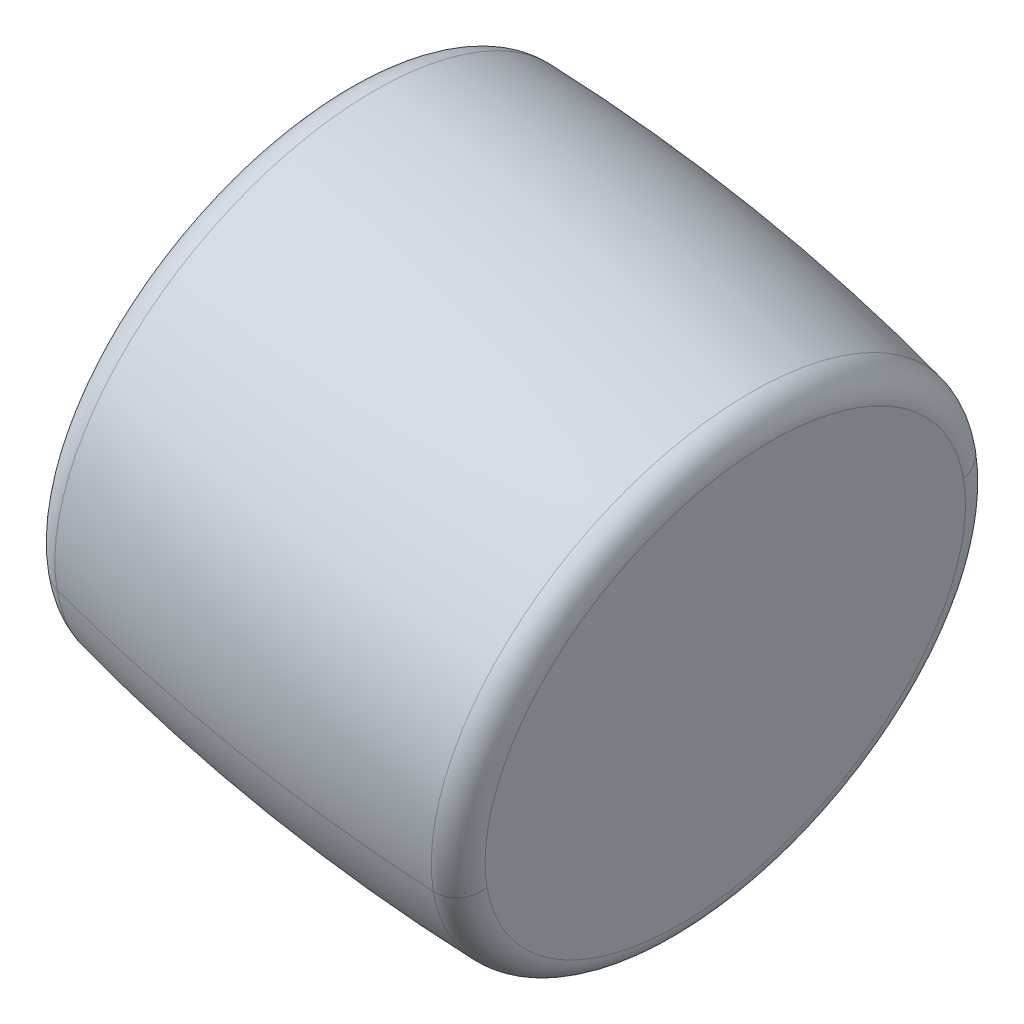
ISO-10303-21;
HEADER;
FILE_DESCRIPTION(('STEP AP214'),'2;1');
FILE_NAME('part.step','',(''),(''),'','','');
FILE_SCHEMA(('AUTOMOTIVE_DESIGN { 1 0 10303 214 1 1 1 1 }'));
ENDSEC;
DATA;
#1=APPLICATION_CONTEXT('core data for automotive mechanical design processes');
#2=APPLICATION_PROTOCOL_DEFINITION('international standard','automotive_design',2000,#1);
#3=PRODUCT_CONTEXT('',#1,'mechanical');
#4=PRODUCT('Part','Part','',(#3));
#5=PRODUCT_RELATED_PRODUCT_CATEGORY('part','',(#4));
#6=PRODUCT_DEFINITION_FORMATION('','',#4);
#7=PRODUCT_DEFINITION_CONTEXT('part definition',#1,'design');
#8=PRODUCT_DEFINITION('design','',#6,#7);
#9=PRODUCT_DEFINITION_SHAPE('','',#8);
#10=(LENGTH_UNIT() NAMED_UNIT(*) SI_UNIT(.MILLI.,.METRE.));
#11=(NAMED_UNIT(*) PLANE_ANGLE_UNIT() SI_UNIT($,.RADIAN.));
#12=(NAMED_UNIT(*) SI_UNIT($,.STERADIAN.) SOLID_ANGLE_UNIT());
#13=UNCERTAINTY_MEASURE_WITH_UNIT(LENGTH_MEASURE(1.E-05),#10,'distance_accuracy_value','');
#14=(GEOMETRIC_REPRESENTATION_CONTEXT(3) GLOBAL_UNCERTAINTY_ASSIGNED_CONTEXT((#13)) GLOBAL_UNIT_ASSIGNED_CONTEXT((#10,
#11,#12)) REPRESENTATION_CONTEXT('',''));
#15=CARTESIAN_POINT('',(0.,0.,0.));
#16=DIRECTION('',(0.,0.,1.));
#17=DIRECTION('',(1.,0.,0.));
#18=AXIS2_PLACEMENT_3D('',#15,#16,#17);
#19=CARTESIAN_POINT('',(13.1271658295199,31.470897780581,0.));
#20=DIRECTION('',(0.981627183447684,-0.190808995376441,0.));
#21=DIRECTION('',(0.190808995376441,0.981627183447684,0.));
#22=AXIS2_PLACEMENT_3D('',#19,#20,#21);
#23=PLANE('',#22);
#24=CARTESIAN_POINT('',(12.8582091754808,30.0872357459221,4.33817842139178));
#25=CARTESIAN_POINT('',(12.8446648204057,30.0175560796265,4.31511603856887));
#26=CARTESIAN_POINT('',(12.8312286848676,29.9484331545849,4.29030854774755));
#27=CARTESIAN_POINT('',(12.8046047498575,29.8114648828077,4.23726961898303));
#28=CARTESIAN_POINT('',(12.7914169503855,29.7436195360721,4.20903818103983));
#29=CARTESIAN_POINT('',(12.7653215844995,29.609370516705,4.14921762690648));
#30=CARTESIAN_POINT('',(12.7524140180855,29.5429668440735,4.11762851071633));
#31=CARTESIAN_POINT('',(12.7269101798973,29.4117609709,4.05116916810763));
#32=CARTESIAN_POINT('',(12.7143139081232,29.346958770358,4.01629894168908));
#33=CARTESIAN_POINT('',(12.6894630138139,29.2191120022383,3.94336125890207));
#34=CARTESIAN_POINT('',(12.6772083912787,29.1560674346607,3.9052938025336));
#35=CARTESIAN_POINT('',(12.6530703154741,29.0318877998424,3.82605340121762));
#36=CARTESIAN_POINT('',(12.6411868622047,28.9707527326018,3.78488045627011));
#37=CARTESIAN_POINT('',(12.6178197538633,28.8505393815422,3.69952825804131));
#38=CARTESIAN_POINT('',(12.6063360987912,28.7914610977232,3.65534900476001));
#39=CARTESIAN_POINT('',(12.5837962518007,28.6755036373687,3.56409062396206));
#40=CARTESIAN_POINT('',(12.5727400598823,28.6186244608333,3.51701149644541));
#41=CARTESIAN_POINT('',(12.5510817745805,28.5072022422051,3.42006678427347));
#42=CARTESIAN_POINT('',(12.5404796811972,28.4526592001123,3.37020119961819));
#43=CARTESIAN_POINT('',(12.5197551343248,28.3460406492705,3.26780370390297));
#44=CARTESIAN_POINT('',(12.5096326808357,28.2939651405216,3.21527179284305));
#45=CARTESIAN_POINT('',(12.4898917996321,28.1924071108469,3.10766819824725));
#46=CARTESIAN_POINT('',(12.4802733719176,28.142924589921,3.05259651471136));
#47=CARTESIAN_POINT('',(12.4615637138972,28.0466717436148,2.9400460476854));
#48=CARTESIAN_POINT('',(12.4524724835913,27.9999014182344,2.88256726419531));
#49=CARTESIAN_POINT('',(12.4348391219584,27.9091856368308,2.7653410686816));
#50=CARTESIAN_POINT('',(12.4262969906315,27.8652401808076,2.70559365665796));
#51=CARTESIAN_POINT('',(12.4097824056989,27.7802800065708,2.58397414082686));
#52=CARTESIAN_POINT('',(12.4018099520933,27.7392652883571,2.52210203701938));
#53=CARTESIAN_POINT('',(12.3864539289427,27.6602653977881,2.39638219293779));
#54=CARTESIAN_POINT('',(12.3790703593976,27.6222802254327,2.33253445266366));
#55=CARTESIAN_POINT('',(12.3649098920337,27.5494309361876,2.20301715044755));
#56=CARTESIAN_POINT('',(12.3581329942149,27.5145668192978,2.13734758850556));
#57=CARTESIAN_POINT('',(12.3452021964438,27.4480436316952,2.0043448466804));
#58=CARTESIAN_POINT('',(12.3390482964917,27.4163845609823,1.93701166679722));
#59=CARTESIAN_POINT('',(12.327378319738,27.3563477352078,1.80084390061771));
#60=CARTESIAN_POINT('',(12.3218622429365,27.3279699801462,1.73200931432138));
#61=CARTESIAN_POINT('',(12.3114812011963,27.2745641501718,1.59300456386314));
#62=CARTESIAN_POINT('',(12.3066162362576,27.249536075259,1.52283439970124));
#63=CARTESIAN_POINT('',(12.2975491383698,27.2028899004068,1.38132753958351));
#64=CARTESIAN_POINT('',(12.2933470054206,27.1812718004675,1.30999084362768));
#65=CARTESIAN_POINT('',(12.2856156948181,27.1414976554585,1.16632277627101));
#66=CARTESIAN_POINT('',(12.2820865171647,27.1233416103889,1.09399140487018));
#67=CARTESIAN_POINT('',(12.2757096192519,27.0905353146223,0.948508239232672));
#68=CARTESIAN_POINT('',(12.2728618989925,27.0758850639253,0.875356444996008));
#69=CARTESIAN_POINT('',(12.2678547762751,27.050125650641,0.72840866276651));
#70=CARTESIAN_POINT('',(12.2656953738171,27.0390164880538,0.654612674773676));
#71=CARTESIAN_POINT('',(12.2620700888923,27.0203660139347,0.506554286030679));
#72=CARTESIAN_POINT('',(12.2606042064255,27.0128247024029,0.432291885280516));
#73=CARTESIAN_POINT('',(12.2583694929221,27.0013280980748,0.283479575650885));
#74=CARTESIAN_POINT('',(12.2576006618856,26.9973728052784,0.208929666771416));
#75=CARTESIAN_POINT('',(12.2567619034244,26.9930577670681,0.0597219381434687));
#76=CARTESIAN_POINT('',(12.2566919759996,26.992698021654,-0.0149358816050108));
#77=CARTESIAN_POINT('',(12.257251193223,26.9955749448663,-0.164179574743957));
#78=CARTESIAN_POINT('',(12.2578803378711,26.9988116134928,-0.238765448134424));
#79=CARTESIAN_POINT('',(12.2598361835759,27.0088735673679,-0.387685564655395));
#80=CARTESIAN_POINT('',(12.2611628846325,27.0156988526166,-0.462019807785898));
#81=CARTESIAN_POINT('',(12.264510647015,27.0329215970262,-0.610257586084332));
#82=CARTESIAN_POINT('',(12.266531708341,27.0433190561871,-0.684161121252261));
#83=CARTESIAN_POINT('',(12.2712633223485,27.0676611000315,-0.831359443536141));
#84=CARTESIAN_POINT('',(12.27397387503,27.0816056847149,-0.90465423065209));
#85=CARTESIAN_POINT('',(12.2800779417899,27.1130083858782,-1.05045848326998));
#86=CARTESIAN_POINT('',(12.2834714558683,27.1304665023581,-1.12296794877192));
#87=CARTESIAN_POINT('',(12.2909332701491,27.1688542089828,-1.26702687650833));
#88=CARTESIAN_POINT('',(12.2950015703515,27.1897837991275,-1.33857633874279));
#89=CARTESIAN_POINT('',(12.303803155989,27.2350640318659,-1.48054289102272));
#90=CARTESIAN_POINT('',(12.3085364414241,27.2594146744595,-1.55095998106819));
#91=CARTESIAN_POINT('',(12.3186565946276,27.3114783492648,-1.6904921480324));
#92=CARTESIAN_POINT('',(12.324043462396,27.3391913814765,-1.75960722495114));
#93=CARTESIAN_POINT('',(12.33545780283,27.397913072396,-1.89636886138784));
#94=CARTESIAN_POINT('',(12.3414852754956,27.4289217311037,-1.9640154209058));
#95=CARTESIAN_POINT('',(12.3541663050142,27.4941599724404,-2.09767705605391));
#96=CARTESIAN_POINT('',(12.3608198618673,27.5283895550694,-2.16369213168406));
#97=CARTESIAN_POINT('',(12.3747370307597,27.5999871821858,-2.29393176295713));
#98=CARTESIAN_POINT('',(12.382000642799,27.6373552266732,-2.35815631860005));
#99=CARTESIAN_POINT('',(12.3971204233863,27.7151397546144,-2.4846601873187));
#100=CARTESIAN_POINT('',(12.4049765919343,27.7555562380681,-2.54693950039443));
#101=CARTESIAN_POINT('',(12.4212625593408,27.8393402770931,-2.66940284765848));
#102=CARTESIAN_POINT('',(12.4296923581993,27.8827078326644,-2.72958688184681));
#103=CARTESIAN_POINT('',(12.447105278103,27.9722895396846,-2.84771468272618));
#104=CARTESIAN_POINT('',(12.4560883991481,28.0185036911336,-2.90565844941724));
#105=CARTESIAN_POINT('',(12.4745863222997,28.1136672559703,-3.01916612369285));
#106=CARTESIAN_POINT('',(12.4841011244062,28.1626166693582,-3.07473003127741));
#107=CARTESIAN_POINT('',(12.5036394876886,28.2631328346485,-3.18334412901982));
#108=CARTESIAN_POINT('',(12.5136630488647,28.314699586551,-3.23639431917768));
#109=CARTESIAN_POINT('',(12.5341947826494,28.4203262000484,-3.33985317951197));
#110=CARTESIAN_POINT('',(12.5447029552582,28.4743860616435,-3.3902618496884));
#111=CARTESIAN_POINT('',(12.5661785968003,28.5848686595844,-3.48831623115809));
#112=CARTESIAN_POINT('',(12.5771460657336,28.6412913959303,-3.53596194245135));
#113=CARTESIAN_POINT('',(12.5995138783315,28.7563638160591,-3.62837562346292));
#114=CARTESIAN_POINT('',(12.610914221996,28.815013499842,-3.67314359318124));
#115=CARTESIAN_POINT('',(12.6341203196299,28.9343985226195,-3.75969394108267));
#116=CARTESIAN_POINT('',(12.6459260735992,28.995133861614,-3.80147631926578));
#117=CARTESIAN_POINT('',(12.6699145507473,29.1185438780633,-3.88195482668805));
#118=CARTESIAN_POINT('',(12.6820972739261,29.1812185555181,-3.92065095592721));
#119=CARTESIAN_POINT('',(12.7068103402458,29.3083562601003,-3.99486374309686));
#120=CARTESIAN_POINT('',(12.7193406833868,29.3728192872276,-4.03038040102735));
#121=CARTESIAN_POINT('',(12.7447188029367,29.5033783940763,-4.09814868283981));
#122=CARTESIAN_POINT('',(12.7575665793458,29.5694744737976,-4.13040030672177));
#123=CARTESIAN_POINT('',(12.7835486140131,29.7031404545887,-4.19156082345037));
#124=CARTESIAN_POINT('',(12.7966828722715,29.7707103556586,-4.220469716297));
#125=CARTESIAN_POINT('',(12.823206229059,29.9071611973367,-4.27487512689985));
#126=CARTESIAN_POINT('',(12.8365953275881,29.976042137945,-4.30037164465608));
#127=CARTESIAN_POINT('',(12.863596109406,30.114949118481,-4.34789088173388));
#128=CARTESIAN_POINT('',(12.8772077926949,30.1849751584086,-4.36991360105545));
#129=CARTESIAN_POINT('',(12.9046209522948,30.3260036387192,-4.41043218660321));
#130=CARTESIAN_POINT('',(12.918422428606,30.3970060791021,-4.4289280528294));
#131=CARTESIAN_POINT('',(12.9461819252856,30.5398163092263,-4.46234837402804));
#132=CARTESIAN_POINT('',(12.9601399456539,30.6116240989676,-4.47727282900049));
#133=CARTESIAN_POINT('',(12.9881789043537,30.7558720365499,-4.50351437335958));
#134=CARTESIAN_POINT('',(13.002259842685,30.8283121843909,-4.51483146274623));
#135=CARTESIAN_POINT('',(13.0305107150992,30.9736503235243,-4.53383101212194));
#136=CARTESIAN_POINT('',(13.0446806491821,31.0465483148167,-4.54151347211101));
#137=CARTESIAN_POINT('',(13.073075376478,31.1926265231591,-4.55322525479408));
#138=CARTESIAN_POINT('',(13.0873001696909,31.2658067402091,-4.55725457748808));
#139=CARTESIAN_POINT('',(13.1157703465085,31.4122731026916,-4.56165037925578));
#140=CARTESIAN_POINT('',(13.1300157301132,31.4855592481241,-4.56201685832947));
#141=CARTESIAN_POINT('',(13.1584927692087,31.6320609139657,-4.55908608749062));
#142=CARTESIAN_POINT('',(13.1727244246995,31.7052764343748,-4.55578883757806));
#143=CARTESIAN_POINT('',(13.2011397227431,31.8514604700401,-4.54553856140752));
#144=CARTESIAN_POINT('',(13.2153233652959,31.9244289852962,-4.53858553514952));
#145=CARTESIAN_POINT('',(13.2436084660329,32.0699432138853,-4.52104042211526));
#146=CARTESIAN_POINT('',(13.2577099242172,32.1424889272182,-4.510448335339));
#147=CARTESIAN_POINT('',(13.285796691262,32.2869828174142,-4.48565074774443));
#148=CARTESIAN_POINT('',(13.2997820001225,32.3589309942774,-4.47144524692614));
#149=CARTESIAN_POINT('',(13.3276027517082,32.5020563535748,-4.43945457131957));
#150=CARTESIAN_POINT('',(13.3414381944333,32.573233536009,-4.42166939653129));
#151=CARTESIAN_POINT('',(13.3689259761729,32.7146459139474,-4.38256401871189));
#152=CARTESIAN_POINT('',(13.3825783151873,32.7848811094515,-4.36124381568077));
#153=CARTESIAN_POINT('',(13.3961224835588,32.85455981524,-4.33817842139179));
#154=B_SPLINE_CURVE_WITH_KNOTS('',3,(#24,#25,#26,#27,#28,#29,#30,#31,#32,#33,#34,#35,#36,#37,
#38,#39,#40,#41,#42,#43,#44,#45,#46,#47,#48,#49,#50,#51,#52,#53,#54,#55,#56,#57,#58,#59,#60,#61,
#62,#63,#64,#65,#66,#67,#68,#69,#70,#71,#72,#73,#74,#75,#76,#77,#78,#79,#80,#81,#82,#83,#84,#85,
#86,#87,#88,#89,#90,#91,#92,#93,#94,#95,#96,#97,#98,#99,#100,#101,#102,#103,#104,#105,#106,#107,
#108,#109,#110,#111,#112,#113,#114,#115,#116,#117,#118,#119,#120,#121,#122,#123,#124,#125,#126,
#127,#128,#129,#130,#131,#132,#133,#134,#135,#136,#137,#138,#139,#140,#141,#142,#143,#144,#145,
#146,#147,#148,#149,#150,#151,#152,#153),.UNSPECIFIED.,.F.,.F.,(4,2,2,2,2,2,2,2,2,2,2,2,2,2,2,2,
2,2,2,2,2,2,2,2,2,2,2,2,2,2,2,2,2,2,2,2,2,2,2,2,2,2,2,2,2,2,2,2,2,2,2,2,2,2,2,2,2,2,2,2,2,2,2,2,
4),(0.,0.223886227975755,0.447772455951512,0.671658683927268,0.895544911903021,1.11943113987878,
1.34331736785453,1.56720359583029,1.79108982380605,2.0149760517818,2.23886227975756,
2.46274850773331,2.68663473570907,2.91052096368483,3.13440719166058,3.35829341963634,
3.58217964761209,3.80606587558785,4.02995210356361,4.25383833153936,4.47772455951512,
4.70161078749087,4.92549701546663,5.14938324344238,5.37326947141814,5.5971556993939,
5.82104192736965,6.04492815534541,6.26881438332116,6.49270061129692,6.71658683927268,
6.94047306724843,7.16435929522419,7.38824552319995,7.6121317511757,7.83601797915146,
8.05990420712721,8.28379043510297,8.50767666307872,8.73156289105448,8.95544911903023,
9.17933534700599,9.40322157498174,9.6271078029575,9.85099403093326,10.074880258909,
10.2987664868848,10.5226527148605,10.7465389428363,10.970425170812,11.1943113987878,
11.4181976267635,11.6420838547393,11.8659700827151,12.0898563106908,12.3137425386666,
12.5376287666423,12.7615149946181,12.9854012225938,13.2092874505696,13.4331736785454,
13.6570599065211,13.8809461344969,14.1048323624726,14.3287185904484),.UNSPECIFIED.);
#155=CARTESIAN_POINT('',(12.8582091754808,30.0872357459221,4.33817842139178));
#156=VERTEX_POINT('',#155);
#157=CARTESIAN_POINT('',(13.3961224835588,32.85455981524,-4.33817842139178));
#158=VERTEX_POINT('',#157);
#159=EDGE_CURVE('E11',#156,#158,#154,.T.);
#160=ORIENTED_EDGE('',*,*,#159,.F.);
#161=CARTESIAN_POINT('',(13.3961224835588,32.85455981524,-4.33817842139178));
#162=CARTESIAN_POINT('',(13.4096668386339,32.9242394815356,-4.31511603856887));
#163=CARTESIAN_POINT('',(13.423102974172,32.9933624065772,-4.29030854774755));
#164=CARTESIAN_POINT('',(13.4497269091821,33.1303306783544,-4.23726961898303));
#165=CARTESIAN_POINT('',(13.4629147086541,33.19817602509,-4.20903818103984));
#166=CARTESIAN_POINT('',(13.4890100745401,33.3324250444571,-4.14921762690648));
#167=CARTESIAN_POINT('',(13.5019176409541,33.3988287170886,-4.11762851071633));
#168=CARTESIAN_POINT('',(13.5274214791422,33.5300345902621,-4.05116916810763));
#169=CARTESIAN_POINT('',(13.5400177509164,33.5948367908041,-4.01629894168908));
#170=CARTESIAN_POINT('',(13.5648686452257,33.7226835589237,-3.94336125890207));
#171=CARTESIAN_POINT('',(13.5771232677609,33.7857281265014,-3.9052938025336));
#172=CARTESIAN_POINT('',(13.6012613435655,33.9099077613197,-3.82605340121762));
#173=CARTESIAN_POINT('',(13.6131447968348,33.9710428285603,-3.78488045627011));
#174=CARTESIAN_POINT('',(13.6365119051763,34.0912561796199,-3.69952825804131));
#175=CARTESIAN_POINT('',(13.6479955602483,34.1503344634389,-3.65534900476001));
#176=CARTESIAN_POINT('',(13.6705354072388,34.2662919237933,-3.56409062396206));
#177=CARTESIAN_POINT('',(13.6815915991573,34.3231711003288,-3.51701149644541));
#178=CARTESIAN_POINT('',(13.7032498844591,34.434593318957,-3.42006678427348));
#179=CARTESIAN_POINT('',(13.7138519778424,34.4891363610498,-3.37020119961819));
#180=CARTESIAN_POINT('',(13.7345765247148,34.5957549118916,-3.26780370390298));
#181=CARTESIAN_POINT('',(13.7446989782039,34.6478304206405,-3.21527179284305));
#182=CARTESIAN_POINT('',(13.7644398594075,34.7493884503152,-3.10766819824725));
#183=CARTESIAN_POINT('',(13.774058287122,34.7988709712411,-3.05259651471136));
#184=CARTESIAN_POINT('',(13.7927679451423,34.8951238175473,-2.9400460476854));
#185=CARTESIAN_POINT('',(13.8018591754482,34.9418941429277,-2.88256726419532));
#186=CARTESIAN_POINT('',(13.8194925370811,35.0326099243313,-2.7653410686816));
#187=CARTESIAN_POINT('',(13.8280346684081,35.0765553803545,-2.70559365665797));
#188=CARTESIAN_POINT('',(13.8445492533407,35.1615155545913,-2.58397414082686));
#189=CARTESIAN_POINT('',(13.8525217069462,35.202530272805,-2.52210203701939));
#190=CARTESIAN_POINT('',(13.8678777300969,35.281530163374,-2.39638219293779));
#191=CARTESIAN_POINT('',(13.8752612996419,35.3195153357293,-2.33253445266367));
#192=CARTESIAN_POINT('',(13.8894217670059,35.3923646249745,-2.20301715044756));
#193=CARTESIAN_POINT('',(13.8961986648247,35.4272287418643,-2.13734758850557));
#194=CARTESIAN_POINT('',(13.9091294625957,35.4937519294669,-2.0043448466804));
#195=CARTESIAN_POINT('',(13.9152833625479,35.5254110001798,-1.93701166679723));
#196=CARTESIAN_POINT('',(13.9269533393016,35.5854478259543,-1.80084390061772));
#197=CARTESIAN_POINT('',(13.9324694161031,35.6138255810159,-1.73200931432138));
#198=CARTESIAN_POINT('',(13.9428504578433,35.6672314109903,-1.59300456386315));
#199=CARTESIAN_POINT('',(13.947715422782,35.6922594859031,-1.52283439970124));
#200=CARTESIAN_POINT('',(13.9567825206698,35.7389056607553,-1.38132753958351));
#201=CARTESIAN_POINT('',(13.960984653619,35.7605237606946,-1.30999084362768));
#202=CARTESIAN_POINT('',(13.9687159642215,35.8002979057036,-1.16632277627102));
#203=CARTESIAN_POINT('',(13.9722451418748,35.8184539507732,-1.09399140487018));
#204=CARTESIAN_POINT('',(13.9786220397876,35.8512602465398,-0.948508239232677));
#205=CARTESIAN_POINT('',(13.981469760047,35.8659104972368,-0.875356444996013));
#206=CARTESIAN_POINT('',(13.9864768827644,35.891669910521,-0.728408662766514));
#207=CARTESIAN_POINT('',(13.9886362852224,35.9027790731083,-0.654612674773681));
#208=CARTESIAN_POINT('',(13.9922615701472,35.9214295472274,-0.506554286030684));
#209=CARTESIAN_POINT('',(13.9937274526141,35.9289708587592,-0.432291885280521));
#210=CARTESIAN_POINT('',(13.9959621661174,35.9404674630873,-0.283479575650889));
#211=CARTESIAN_POINT('',(13.9967309971539,35.9444227558836,-0.208929666771421));
#212=CARTESIAN_POINT('',(13.9975697556152,35.948737794094,-0.0597219381434726));
#213=CARTESIAN_POINT('',(13.99763968304,35.9490975395081,0.0149358816050076));
#214=CARTESIAN_POINT('',(13.9970804658166,35.9462206162957,0.164179574743954));
#215=CARTESIAN_POINT('',(13.9964513211684,35.9429839476693,0.23876544813442));
#216=CARTESIAN_POINT('',(13.9944954754637,35.9329219937942,0.38768556465539));
#217=CARTESIAN_POINT('',(13.9931687744071,35.9260967085455,0.462019807785894));
#218=CARTESIAN_POINT('',(13.9898210120245,35.9088739641359,0.610257586084326));
#219=CARTESIAN_POINT('',(13.9877999506986,35.898476504975,0.684161121252254));
#220=CARTESIAN_POINT('',(13.9830683366911,35.8741344611306,0.831359443536133));
#221=CARTESIAN_POINT('',(13.9803577840095,35.8601898764472,0.904654230652085));
#222=CARTESIAN_POINT('',(13.9742537172496,35.8287871752839,1.05045848326998));
#223=CARTESIAN_POINT('',(13.9708602031713,35.8113290588039,1.12296794877192));
#224=CARTESIAN_POINT('',(13.9633983888905,35.7729413521793,1.26702687650833));
#225=CARTESIAN_POINT('',(13.9593300886881,35.7520117620346,1.33857633874279));
#226=CARTESIAN_POINT('',(13.9505285030505,35.7067315292962,1.48054289102272));
#227=CARTESIAN_POINT('',(13.9457952176155,35.6823808867026,1.55095998106819));
#228=CARTESIAN_POINT('',(13.935675064412,35.6303172118972,1.6904921480324));
#229=CARTESIAN_POINT('',(13.9302881966436,35.6026041796856,1.75960722495114));
#230=CARTESIAN_POINT('',(13.9188738562095,35.5438824887661,1.89636886138784));
#231=CARTESIAN_POINT('',(13.912846383544,35.5128738300584,1.9640154209058));
#232=CARTESIAN_POINT('',(13.9001653540254,35.4476355887217,2.09767705605391));
#233=CARTESIAN_POINT('',(13.8935117971723,35.4134060060927,2.16369213168406));
#234=CARTESIAN_POINT('',(13.8795946282799,35.3418083789763,2.29393176295713));
#235=CARTESIAN_POINT('',(13.8723310162406,35.3044403344889,2.35815631860004));
#236=CARTESIAN_POINT('',(13.8572112356532,35.2266558065477,2.48466018731869));
#237=CARTESIAN_POINT('',(13.8493550671052,35.186239323094,2.54693950039443));
#238=CARTESIAN_POINT('',(13.8330690996988,35.102455284069,2.66940284765848));
#239=CARTESIAN_POINT('',(13.8246393008403,35.0590877284977,2.7295868818468));
#240=CARTESIAN_POINT('',(13.8072263809366,34.9695060214775,2.84771468272618));
#241=CARTESIAN_POINT('',(13.7982432598914,34.9232918700285,2.90565844941724));
#242=CARTESIAN_POINT('',(13.7797453367398,34.8281283051918,3.01916612369285));
#243=CARTESIAN_POINT('',(13.7702305346334,34.7791788918039,3.0747300312774));
#244=CARTESIAN_POINT('',(13.7506921713509,34.6786627265136,3.18334412901982));
#245=CARTESIAN_POINT('',(13.7406686101749,34.6270959746111,3.23639431917768));
#246=CARTESIAN_POINT('',(13.7201368763901,34.5214693611137,3.33985317951197));
#247=CARTESIAN_POINT('',(13.7096287037813,34.4674094995186,3.39026184968839));
#248=CARTESIAN_POINT('',(13.6881530622393,34.3569269015777,3.48831623115808));
#249=CARTESIAN_POINT('',(13.6771855933059,34.3005041652318,3.53596194245134));
#250=CARTESIAN_POINT('',(13.6548177807081,34.185431745103,3.62837562346292));
#251=CARTESIAN_POINT('',(13.6434174370436,34.1267820613201,3.67314359318124));
#252=CARTESIAN_POINT('',(13.6202113394097,34.0073970385426,3.75969394108267));
#253=CARTESIAN_POINT('',(13.6084055854403,33.9466616995481,3.80147631926578));
#254=CARTESIAN_POINT('',(13.5844171082922,33.8232516830987,3.88195482668805));
#255=CARTESIAN_POINT('',(13.5722343851135,33.760577005644,3.92065095592721));
#256=CARTESIAN_POINT('',(13.5475213187938,33.6334393010618,3.99486374309686));
#257=CARTESIAN_POINT('',(13.5349909756528,33.5689762739345,4.03038040102735));
#258=CARTESIAN_POINT('',(13.5096128561028,33.4384171670858,4.0981486828398));
#259=CARTESIAN_POINT('',(13.4967650796938,33.3723210873645,4.13040030672177));
#260=CARTESIAN_POINT('',(13.4707830450264,33.2386551065734,4.19156082345037));
#261=CARTESIAN_POINT('',(13.4576487867681,33.1710852055035,4.22046971629699));
#262=CARTESIAN_POINT('',(13.4311254299806,33.0346343638254,4.27487512689985));
#263=CARTESIAN_POINT('',(13.4177363314515,32.9657534232171,4.30037164465607));
#264=CARTESIAN_POINT('',(13.3907355496335,32.8268464426811,4.34789088173387));
#265=CARTESIAN_POINT('',(13.3771238663447,32.7568204027535,4.36991360105545));
#266=CARTESIAN_POINT('',(13.3497107067447,32.6157919224429,4.41043218660321));
#267=CARTESIAN_POINT('',(13.3359092304336,32.54478948206,4.4289280528294));
#268=CARTESIAN_POINT('',(13.308149733754,32.4019792519357,4.46234837402803));
#269=CARTESIAN_POINT('',(13.2941917133856,32.3301714621945,4.47727282900049));
#270=CARTESIAN_POINT('',(13.2661527546859,32.1859235246122,4.50351437335958));
#271=CARTESIAN_POINT('',(13.2520718163546,32.1134833767712,4.51483146274623));
#272=CARTESIAN_POINT('',(13.2238209439404,31.9681452376378,4.53383101212194));
#273=CARTESIAN_POINT('',(13.2096510098574,31.8952472463454,4.54151347211101));
#274=CARTESIAN_POINT('',(13.1812562825616,31.749169038003,4.55322525479408));
#275=CARTESIAN_POINT('',(13.1670314893486,31.675988820953,4.55725457748808));
#276=CARTESIAN_POINT('',(13.138561312531,31.5295224584704,4.56165037925578));
#277=CARTESIAN_POINT('',(13.1243159289263,31.456236313038,4.56201685832947));
#278=CARTESIAN_POINT('',(13.0958388898309,31.3097346471964,4.55908608749062));
#279=CARTESIAN_POINT('',(13.0816072343401,31.2365191267873,4.55578883757806));
#280=CARTESIAN_POINT('',(13.0531919362965,31.090335091122,4.54553856140752));
#281=CARTESIAN_POINT('',(13.0390082937437,31.0173665758659,4.53858553514953));
#282=CARTESIAN_POINT('',(13.0107231930066,30.8718523472768,4.52104042211526));
#283=CARTESIAN_POINT('',(12.9966217348224,30.7993066339439,4.510448335339));
#284=CARTESIAN_POINT('',(12.9685349677776,30.6548127437479,4.48565074774443));
#285=CARTESIAN_POINT('',(12.954549658917,30.5828645668847,4.47144524692614));
#286=CARTESIAN_POINT('',(12.9267289073314,30.4397392075873,4.43945457131957));
#287=CARTESIAN_POINT('',(12.9128934646062,30.3685620251531,4.42166939653129));
#288=CARTESIAN_POINT('',(12.8854056828667,30.2271496472147,4.3825640187119));
#289=CARTESIAN_POINT('',(12.8717533438523,30.1569144517105,4.36124381568077));
#290=CARTESIAN_POINT('',(12.8582091754808,30.0872357459221,4.33817842139179));
#291=B_SPLINE_CURVE_WITH_KNOTS('',3,(#161,#162,#163,#164,#165,#166,#167,#168,#169,#170,#171,
#172,#173,#174,#175,#176,#177,#178,#179,#180,#181,#182,#183,#184,#185,#186,#187,#188,#189,#190,
#191,#192,#193,#194,#195,#196,#197,#198,#199,#200,#201,#202,#203,#204,#205,#206,#207,#208,#209,
#210,#211,#212,#213,#214,#215,#216,#217,#218,#219,#220,#221,#222,#223,#224,#225,#226,#227,#228,
#229,#230,#231,#232,#233,#234,#235,#236,#237,#238,#239,#240,#241,#242,#243,#244,#245,#246,#247,
#248,#249,#250,#251,#252,#253,#254,#255,#256,#257,#258,#259,#260,#261,#262,#263,#264,#265,#266,
#267,#268,#269,#270,#271,#272,#273,#274,#275,#276,#277,#278,#279,#280,#281,#282,#283,#284,#285,
#286,#287,#288,#289,#290),.UNSPECIFIED.,.F.,.F.,(4,2,2,2,2,2,2,2,2,2,2,2,2,2,2,2,2,2,2,2,2,2,2,
2,2,2,2,2,2,2,2,2,2,2,2,2,2,2,2,2,2,2,2,2,2,2,2,2,2,2,2,2,2,2,2,2,2,2,2,2,2,2,2,2,4),(0.,
0.223886227975752,0.447772455951512,0.671658683927267,0.895544911903021,1.11943113987877,
1.34331736785453,1.56720359583029,1.79108982380604,2.0149760517818,2.23886227975756,
2.46274850773331,2.68663473570907,2.91052096368482,3.13440719166058,3.35829341963633,
3.58217964761209,3.80606587558785,4.0299521035636,4.25383833153936,4.47772455951511,
4.70161078749087,4.92549701546662,5.14938324344238,5.37326947141814,5.59715569939389,
5.82104192736965,6.0449281553454,6.26881438332116,6.49270061129691,6.71658683927267,
6.94047306724843,7.16435929522418,7.38824552319994,7.61213175117569,7.83601797915145,
8.05990420712721,8.28379043510296,8.50767666307872,8.73156289105447,8.95544911903023,
9.17933534700598,9.40322157498174,9.6271078029575,9.85099403093325,10.074880258909,
10.2987664868848,10.5226527148605,10.7465389428363,10.970425170812,11.1943113987878,
11.4181976267635,11.6420838547393,11.8659700827151,12.0898563106908,12.3137425386666,
12.5376287666423,12.7615149946181,12.9854012225938,13.2092874505696,13.4331736785453,
13.6570599065211,13.8809461344969,14.1048323624726,14.3287185904484),.UNSPECIFIED.);
#292=EDGE_CURVE('E26',#158,#156,#291,.T.);
#293=ORIENTED_EDGE('',*,*,#292,.F.);
#294=EDGE_LOOP('',(#160,#293));
#295=FACE_BOUND('',#294,.T.);
#296=ADVANCED_FACE('F17',(#295),#23,.F.);
#297=CARTESIAN_POINT('',(13.6670607804165,31.3659528331239,0.));
#298=DIRECTION('',(0.981627183447684,-0.190808995376441,0.));
#299=DIRECTION('',(-0.181470138420496,-0.933582929390378,-0.309016994374947));
#300=AXIS2_PLACEMENT_3D('',#297,#298,#299);
#301=TOROIDAL_SURFACE('',#300,4.56143073209906,0.550000000000544);
#302=CARTESIAN_POINT('',(13.9360174344555,32.7496148677829,-4.33817842139178));
#303=DIRECTION('',(0.181470138420496,0.933582929390381,0.309016994374939));
#304=DIRECTION('',(-0.0425078363299844,0.32138749860082,-0.945993213291539));
#305=AXIS2_PLACEMENT_3D('',#302,#303,#304);
#306=CIRCLE('',#305,0.550000000000542);
#307=CARTESIAN_POINT('',(13.912638124474,32.9263779920135,-4.85847468870264));
#308=VERTEX_POINT('',#307);
#309=EDGE_CURVE('E104',#308,#158,#306,.T.);
#310=ORIENTED_EDGE('',*,*,#309,.T.);
#311=ORIENTED_EDGE('',*,*,#292,.T.);
#312=CARTESIAN_POINT('',(13.3981041263776,29.9822907984649,4.33817842139178));
#313=DIRECTION('',(-0.181470138420496,-0.933582929390378,-0.309016994374948));
#314=DIRECTION('',(-0.159806455554985,-0.282061584001272,0.945993213291536));
#315=AXIS2_PLACEMENT_3D('',#312,#313,#314);
#316=CIRCLE('',#315,0.550000000000544);
#317=CARTESIAN_POINT('',(13.3102105758222,29.8271569272641,4.85847468870264));
#318=VERTEX_POINT('',#317);
#319=EDGE_CURVE('E100',#318,#156,#316,.T.);
#320=ORIENTED_EDGE('',*,*,#319,.F.);
#321=CARTESIAN_POINT('',(13.6114243501481,31.3767674596388,0.));
#322=DIRECTION('',(0.981627183447684,-0.190808995376441,0.));
#323=DIRECTION('',(0.0589632222509302,0.303339481825745,-0.951056516295155));
#324=AXIS2_PLACEMENT_3D('',#321,#322,#323);
#325=CIRCLE('',#324,5.10850260258861);
#326=EDGE_CURVE('E95',#308,#318,#325,.T.);
#327=ORIENTED_EDGE('',*,*,#326,.F.);
#328=EDGE_LOOP('',(#310,#311,#320,#327));
#329=FACE_BOUND('',#328,.T.);
#330=ADVANCED_FACE('F111',(#329),#301,.T.);
#331=CARTESIAN_POINT('',(17.2499999999993,30.6695,0.));
#332=DIRECTION('',(0.981627183447684,-0.190808995376441,0.));
#333=DIRECTION('',(-0.181470138420496,-0.93358292939038,-0.309016994374941));
#334=AXIS2_PLACEMENT_3D('',#331,#332,#333);
#335=DEGENERATE_TOROIDAL_SURFACE('',#334,30.6694999998932,35.9694999998936,.F.);
#336=CARTESIAN_POINT('',(15.4416274551807,21.366229762178,29.1684278264127));
#337=DIRECTION('',(0.181470138420497,0.933582929390382,0.309016994374935));
#338=DIRECTION('',(0.15980655905532,0.282061560422556,-0.945993202837574));
#339=AXIS2_PLACEMENT_3D('',#336,#337,#338);
#340=CIRCLE('',#339,35.9694999998936);
#341=CARTESIAN_POINT('',(21.1897894811041,31.5118430597671,-4.85847468295269));
#342=VERTEX_POINT('',#341);
#343=EDGE_CURVE('E90',#342,#308,#340,.T.);
#344=ORIENTED_EDGE('',*,*,#343,.T.);
#345=ORIENTED_EDGE('',*,*,#326,.T.);
#346=CARTESIAN_POINT('',(19.0583725448179,39.9727702378224,-29.1684278264126));
#347=DIRECTION('',(-0.181470138420496,-0.933582929390378,-0.309016994374947));
#348=DIRECTION('',(0.0425079411265631,-0.321387515510945,0.94599320283757));
#349=AXIS2_PLACEMENT_3D('',#346,#347,#348);
#350=CIRCLE('',#349,35.9694999998936);
#351=CARTESIAN_POINT('',(20.5873619331653,28.4126219986857,4.85847468295266));
#352=VERTEX_POINT('',#351);
#353=EDGE_CURVE('E79',#352,#318,#350,.T.);
#354=ORIENTED_EDGE('',*,*,#353,.F.);
#355=CARTESIAN_POINT('',(20.8885757071347,29.9622325292266,0.));
#356=DIRECTION('',(0.981627183447684,-0.190808995376441,0.));
#357=DIRECTION('',(0.0589632222509242,0.303339481825713,-0.951056516295165));
#358=AXIS2_PLACEMENT_3D('',#355,#356,#357);
#359=CIRCLE('',#358,5.10850259654274);
#360=EDGE_CURVE('E77',#342,#352,#359,.T.);
#361=ORIENTED_EDGE('',*,*,#360,.F.);
#362=EDGE_LOOP('',(#344,#345,#354,#361));
#363=FACE_BOUND('',#362,.T.);
#364=ADVANCED_FACE('F120',(#363),#335,.F.);
#365=CARTESIAN_POINT('',(20.8329392195851,29.9730471668758,0.));
#366=DIRECTION('',(0.981627183447684,-0.190808995376441,0.));
#367=DIRECTION('',(-0.181470138419269,-0.933582929384064,-0.309016994394743));
#368=AXIS2_PLACEMENT_3D('',#365,#366,#367);
#369=TOROIDAL_SURFACE('',#368,4.56143073209972,0.549999999999557);
#370=CARTESIAN_POINT('',(21.1018958736414,31.3567092016235,-4.3381784213631));
#371=DIRECTION('',(0.181470138419268,0.933582929384071,0.309016994394725));
#372=DIRECTION('',(0.981627183447685,-0.190808995376439,0.));
#373=AXIS2_PLACEMENT_3D('',#370,#371,#372);
#374=CIRCLE('',#373,0.549999999999558);
#375=CARTESIAN_POINT('',(21.6417908245372,31.2517642541666,-4.3381784213631));
#376=VERTEX_POINT('',#375);
#377=EDGE_CURVE('E61',#376,#342,#374,.T.);
#378=ORIENTED_EDGE('',*,*,#377,.T.);
#379=ORIENTED_EDGE('',*,*,#360,.T.);
#380=CARTESIAN_POINT('',(20.5639825655461,28.5893851322166,4.33817842139241));
#381=DIRECTION('',(-0.181470138420494,-0.933582929390379,-0.309016994374947));
#382=DIRECTION('',(0.981627183447685,-0.190808995376439,0.));
#383=AXIS2_PLACEMENT_3D('',#380,#381,#382);
#384=CIRCLE('',#383,0.549999999999558);
#385=CARTESIAN_POINT('',(21.1038775164419,28.4844401847597,4.33817842139241));
#386=VERTEX_POINT('',#385);
#387=EDGE_CURVE('E63',#386,#352,#384,.T.);
#388=ORIENTED_EDGE('',*,*,#387,.F.);
#389=CARTESIAN_POINT('',(21.6417908245367,31.2517642541665,-4.33817842136254));
#390=CARTESIAN_POINT('',(21.901724747293,32.5890083603701,-3.89493714105883));
#391=CARTESIAN_POINT('',(22.1291896697724,33.7592139408047,-2.91912196029264));
#392=CARTESIAN_POINT('',(22.2677539887531,34.4720655644875,-1.49024769285635));
#393=CARTESIAN_POINT('',(22.3024676747612,34.6506519972496,1.58302932853664));
#394=CARTESIAN_POINT('',(21.9297012090333,32.7329347789689,3.96242749549468));
#395=CARTESIAN_POINT('',(21.6573453360877,31.3317852790329,4.69156502526844));
#396=CARTESIAN_POINT('',(21.3638800761622,29.8220373975345,4.78031261104191));
#397=CARTESIAN_POINT('',(21.1038775164415,28.4844401847599,4.33817842139188));
#398=B_SPLINE_CURVE_WITH_KNOTS('',5,(#389,#390,#391,#392,#393,#394,#395,#396,#397),
.UNSPECIFIED.,.F.,.F.,(6,3,6),(0.,1.57079632678449,3.14159265356898),.UNSPECIFIED.);
#399=EDGE_CURVE('E55',#376,#386,#398,.T.);
#400=ORIENTED_EDGE('',*,*,#399,.F.);
#401=EDGE_LOOP('',(#378,#379,#388,#400));
#402=FACE_BOUND('',#401,.T.);
#403=ADVANCED_FACE('F58',(#402),#369,.T.);
#404=CARTESIAN_POINT('',(22.2431961859516,34.3457266214611,0.));
#405=DIRECTION('',(-0.981627183447684,0.190808995376441,0.));
#406=DIRECTION('',(-0.190808995376441,-0.981627183447684,0.));
#407=AXIS2_PLACEMENT_3D('',#404,#405,#406);
#408=PLANE('',#407);
#409=ORIENTED_EDGE('',*,*,#399,.T.);
#410=CARTESIAN_POINT('',(21.3728341704809,29.8681022194188,0.));
#411=DIRECTION('',(0.981627183447684,-0.190808995376441,0.));
#412=DIRECTION('',(0.190808995376441,0.981627183447684,0.));
#413=AXIS2_PLACEMENT_3D('',#410,#411,#412);
#414=CIRCLE('',#413,4.56143073209914);
#415=EDGE_CURVE('E67',#386,#376,#414,.T.);
#416=ORIENTED_EDGE('',*,*,#415,.T.);
#417=EDGE_LOOP('',(#409,#416));
#418=FACE_BOUND('',#417,.T.);
#419=ADVANCED_FACE('F70',(#418),#408,.F.);
#420=CARTESIAN_POINT('',(20.8329392195851,29.9730471668758,0.));
#421=DIRECTION('',(0.981627183447684,-0.190808995376441,0.));
#422=DIRECTION('',(0.181470138419883,0.933582929387224,0.309016994384836));
#423=AXIS2_PLACEMENT_3D('',#420,#421,#422);
#424=TOROIDAL_SURFACE('',#423,4.56143073209972,0.549999999999557);
#425=ORIENTED_EDGE('',*,*,#377,.F.);
#426=ORIENTED_EDGE('',*,*,#415,.F.);
#427=ORIENTED_EDGE('',*,*,#387,.T.);
#428=CARTESIAN_POINT('',(20.8885757071347,29.9622325292266,0.));
#429=DIRECTION('',(0.981627183447684,-0.190808995376441,0.));
#430=DIRECTION('',(0.190808995376441,0.981627183447684,0.));
#431=AXIS2_PLACEMENT_3D('',#428,#429,#430);
#432=CIRCLE('',#431,5.10850259654274);
#433=EDGE_CURVE('E72',#352,#342,#432,.T.);
#434=ORIENTED_EDGE('',*,*,#433,.T.);
#435=EDGE_LOOP('',(#425,#426,#427,#434));
#436=FACE_BOUND('',#435,.T.);
#437=ADVANCED_FACE('F75',(#436),#424,.T.);
#438=CARTESIAN_POINT('',(17.2499999999993,30.6695,0.));
#439=DIRECTION('',(0.981627183447684,-0.190808995376441,0.));
#440=DIRECTION('',(0.181470138420496,0.933582929390378,0.309016994374947));
#441=AXIS2_PLACEMENT_3D('',#438,#439,#440);
#442=DEGENERATE_TOROIDAL_SURFACE('',#441,30.6694999998932,35.9694999998936,.F.);
#443=ORIENTED_EDGE('',*,*,#343,.F.);
#444=ORIENTED_EDGE('',*,*,#433,.F.);
#445=ORIENTED_EDGE('',*,*,#353,.T.);
#446=CARTESIAN_POINT('',(13.6114243501481,31.3767674596388,0.));
#447=DIRECTION('',(0.981627183447684,-0.190808995376441,0.));
#448=DIRECTION('',(0.190808995376441,0.981627183447684,0.));
#449=AXIS2_PLACEMENT_3D('',#446,#447,#448);
#450=CIRCLE('',#449,5.10850260258861);
#451=EDGE_CURVE('E151',#318,#308,#450,.T.);
#452=ORIENTED_EDGE('',*,*,#451,.T.);
#453=EDGE_LOOP('',(#443,#444,#445,#452));
#454=FACE_BOUND('',#453,.T.);
#455=ADVANCED_FACE('F171',(#454),#442,.F.);
#456=CARTESIAN_POINT('',(13.6670607804165,31.3659528331239,0.));
#457=DIRECTION('',(0.981627183447684,-0.190808995376441,0.));
#458=DIRECTION('',(0.181470138420496,0.933582929390378,0.309016994374947));
#459=AXIS2_PLACEMENT_3D('',#456,#457,#458);
#460=TOROIDAL_SURFACE('',#459,4.56143073209906,0.550000000000544);
#461=ORIENTED_EDGE('',*,*,#309,.F.);
#462=ORIENTED_EDGE('',*,*,#451,.F.);
#463=ORIENTED_EDGE('',*,*,#319,.T.);
#464=ORIENTED_EDGE('',*,*,#159,.T.);
#465=EDGE_LOOP('',(#461,#462,#463,#464));
#466=FACE_BOUND('',#465,.T.);
#467=ADVANCED_FACE('F162',(#466),#460,.T.);
#468=CLOSED_SHELL('',(#296,#330,#364,#403,#419,#437,#455,#467));
#469=MANIFOLD_SOLID_BREP('B1',#468);
#470=ADVANCED_BREP_SHAPE_REPRESENTATION('',(#18,#469),#14);
#471=SHAPE_DEFINITION_REPRESENTATION(#9,#470);
ENDSEC;
END-ISO-10303-21;
